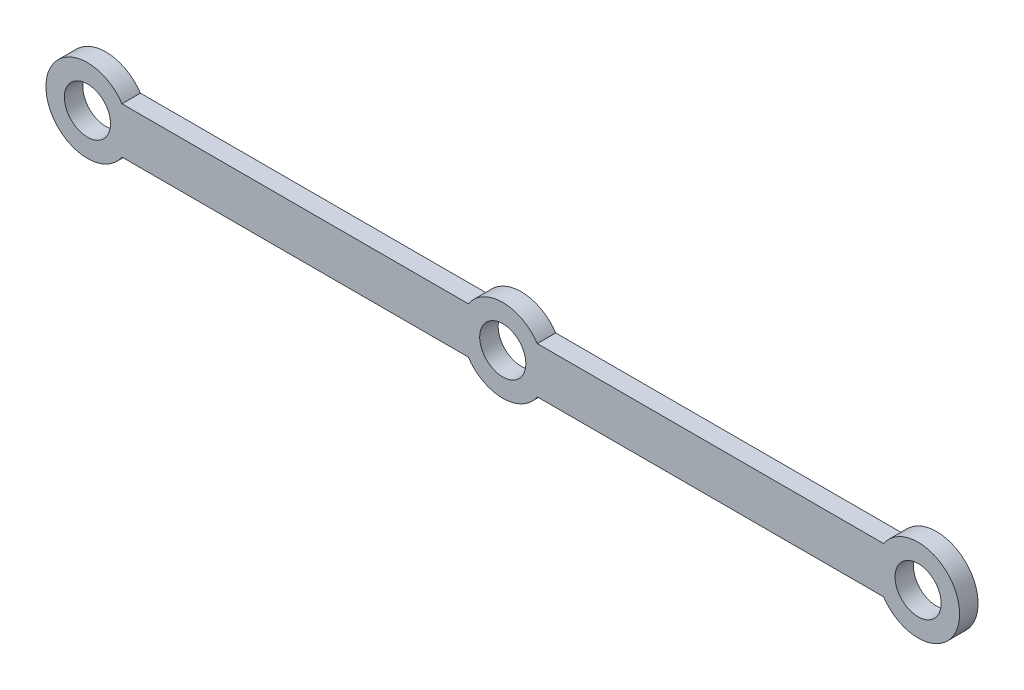
ISO-10303-21;
HEADER;
FILE_DESCRIPTION(('STEP AP214'),'2;1');
FILE_NAME('part.step','',(''),(''),'','','');
FILE_SCHEMA(('AUTOMOTIVE_DESIGN { 1 0 10303 214 1 1 1 1 }'));
ENDSEC;
DATA;
#1=APPLICATION_CONTEXT('core data for automotive mechanical design processes');
#2=APPLICATION_PROTOCOL_DEFINITION('international standard','automotive_design',2000,#1);
#3=PRODUCT_CONTEXT('',#1,'mechanical');
#4=PRODUCT('Part','Part','',(#3));
#5=PRODUCT_RELATED_PRODUCT_CATEGORY('part','',(#4));
#6=PRODUCT_DEFINITION_FORMATION('','',#4);
#7=PRODUCT_DEFINITION_CONTEXT('part definition',#1,'design');
#8=PRODUCT_DEFINITION('design','',#6,#7);
#9=PRODUCT_DEFINITION_SHAPE('','',#8);
#10=(LENGTH_UNIT() NAMED_UNIT(*) SI_UNIT(.MILLI.,.METRE.));
#11=(NAMED_UNIT(*) PLANE_ANGLE_UNIT() SI_UNIT($,.RADIAN.));
#12=(NAMED_UNIT(*) SI_UNIT($,.STERADIAN.) SOLID_ANGLE_UNIT());
#13=UNCERTAINTY_MEASURE_WITH_UNIT(LENGTH_MEASURE(1.E-05),#10,'distance_accuracy_value','');
#14=(GEOMETRIC_REPRESENTATION_CONTEXT(3) GLOBAL_UNCERTAINTY_ASSIGNED_CONTEXT((#13)) GLOBAL_UNIT_ASSIGNED_CONTEXT((#10,
#11,#12)) REPRESENTATION_CONTEXT('',''));
#15=CARTESIAN_POINT('',(0.,0.,0.));
#16=DIRECTION('',(0.,0.,1.));
#17=DIRECTION('',(1.,0.,0.));
#18=AXIS2_PLACEMENT_3D('',#15,#16,#17);
#19=CARTESIAN_POINT('',(0.,0.,1.));
#20=DIRECTION('',(0.,0.,1.));
#21=DIRECTION('',(1.,0.,0.));
#22=AXIS2_PLACEMENT_3D('',#19,#20,#21);
#23=PLANE('',#22);
#24=CARTESIAN_POINT('',(0.,0.,1.));
#25=DIRECTION('',(0.,0.,1.));
#26=DIRECTION('',(1.,0.,0.));
#27=AXIS2_PLACEMENT_3D('',#24,#25,#26);
#28=CIRCLE('',#27,2.5);
#29=CARTESIAN_POINT('',(2.5,0.,1.));
#30=VERTEX_POINT('',#29);
#31=EDGE_CURVE('E296',#30,#30,#28,.T.);
#32=ORIENTED_EDGE('',*,*,#31,.F.);
#33=EDGE_LOOP('',(#32));
#34=FACE_BOUND('',#33,.T.);
#35=CARTESIAN_POINT('',(0.,0.,1.));
#36=DIRECTION('',(0.,0.,1.));
#37=DIRECTION('',(1.,0.,0.));
#38=AXIS2_PLACEMENT_3D('',#35,#36,#37);
#39=CIRCLE('',#38,4.5);
#40=CARTESIAN_POINT('',(-3.74165738677395,-2.49999999999998,1.));
#41=VERTEX_POINT('',#40);
#42=CARTESIAN_POINT('',(3.74165738677395,-2.49999999999998,1.));
#43=VERTEX_POINT('',#42);
#44=EDGE_CURVE('E255',#41,#43,#39,.T.);
#45=ORIENTED_EDGE('',*,*,#44,.T.);
#46=DIRECTION('',(1.,0.,0.));
#47=VECTOR('',#46,1.);
#48=CARTESIAN_POINT('',(3.74165738677395,-2.49999999999998,1.));
#49=LINE('',#48,#47);
#50=CARTESIAN_POINT('',(41.2583426132261,-2.49999999999998,1.));
#51=VERTEX_POINT('',#50);
#52=EDGE_CURVE('E184',#43,#51,#49,.T.);
#53=ORIENTED_EDGE('',*,*,#52,.T.);
#54=CARTESIAN_POINT('',(45.,0.,1.));
#55=DIRECTION('',(0.,0.,1.));
#56=DIRECTION('',(1.,0.,0.));
#57=AXIS2_PLACEMENT_3D('',#54,#55,#56);
#58=CIRCLE('',#57,4.5);
#59=CARTESIAN_POINT('',(41.258342613226,2.50000000000001,1.));
#60=VERTEX_POINT('',#59);
#61=EDGE_CURVE('E274',#51,#60,#58,.T.);
#62=ORIENTED_EDGE('',*,*,#61,.T.);
#63=DIRECTION('',(1.,0.,0.));
#64=VECTOR('',#63,1.);
#65=CARTESIAN_POINT('',(3.74165738677394,2.5,1.));
#66=LINE('',#65,#64);
#67=CARTESIAN_POINT('',(3.74165738677394,2.5,1.));
#68=VERTEX_POINT('',#67);
#69=EDGE_CURVE('E222',#68,#60,#66,.T.);
#70=ORIENTED_EDGE('',*,*,#69,.F.);
#71=CARTESIAN_POINT('',(0.,0.,1.));
#72=DIRECTION('',(0.,0.,1.));
#73=DIRECTION('',(1.,0.,0.));
#74=AXIS2_PLACEMENT_3D('',#71,#72,#73);
#75=CIRCLE('',#74,4.5);
#76=CARTESIAN_POINT('',(-3.74165738677394,2.5,1.));
#77=VERTEX_POINT('',#76);
#78=EDGE_CURVE('E217',#68,#77,#75,.T.);
#79=ORIENTED_EDGE('',*,*,#78,.T.);
#80=DIRECTION('',(1.,0.,0.));
#81=VECTOR('',#80,1.);
#82=CARTESIAN_POINT('',(-41.2583426132261,2.5,1.));
#83=LINE('',#82,#81);
#84=CARTESIAN_POINT('',(-41.2583426132261,2.5,1.));
#85=VERTEX_POINT('',#84);
#86=EDGE_CURVE('E203',#85,#77,#83,.T.);
#87=ORIENTED_EDGE('',*,*,#86,.F.);
#88=CARTESIAN_POINT('',(-45.,0.,1.));
#89=DIRECTION('',(0.,0.,1.));
#90=DIRECTION('',(1.,0.,0.));
#91=AXIS2_PLACEMENT_3D('',#88,#89,#90);
#92=CIRCLE('',#91,4.5);
#93=CARTESIAN_POINT('',(-41.258342613226,-2.49999999999999,1.));
#94=VERTEX_POINT('',#93);
#95=EDGE_CURVE('E210',#85,#94,#92,.T.);
#96=ORIENTED_EDGE('',*,*,#95,.T.);
#97=DIRECTION('',(1.,0.,0.));
#98=VECTOR('',#97,1.);
#99=CARTESIAN_POINT('',(-41.258342613226,-2.49999999999998,1.));
#100=LINE('',#99,#98);
#101=EDGE_CURVE('E142',#94,#41,#100,.T.);
#102=ORIENTED_EDGE('',*,*,#101,.T.);
#103=EDGE_LOOP('',(#45,#53,#62,#70,#79,#87,#96,#102));
#104=FACE_BOUND('',#103,.T.);
#105=CARTESIAN_POINT('',(-45.,0.,1.));
#106=DIRECTION('',(0.,0.,1.));
#107=DIRECTION('',(1.,0.,0.));
#108=AXIS2_PLACEMENT_3D('',#105,#106,#107);
#109=CIRCLE('',#108,2.5);
#110=CARTESIAN_POINT('',(-42.5,0.,1.));
#111=VERTEX_POINT('',#110);
#112=EDGE_CURVE('E234',#111,#111,#109,.T.);
#113=ORIENTED_EDGE('',*,*,#112,.F.);
#114=EDGE_LOOP('',(#113));
#115=FACE_BOUND('',#114,.T.);
#116=CARTESIAN_POINT('',(45.,0.,1.));
#117=DIRECTION('',(0.,0.,1.));
#118=DIRECTION('',(1.,0.,0.));
#119=AXIS2_PLACEMENT_3D('',#116,#117,#118);
#120=CIRCLE('',#119,2.5);
#121=CARTESIAN_POINT('',(47.5,0.,1.));
#122=VERTEX_POINT('',#121);
#123=EDGE_CURVE('E304',#122,#122,#120,.T.);
#124=ORIENTED_EDGE('',*,*,#123,.F.);
#125=EDGE_LOOP('',(#124));
#126=FACE_BOUND('',#125,.T.);
#127=ADVANCED_FACE('F124',(#34,#104,#115,#126),#23,.T.);
#128=CARTESIAN_POINT('',(0.,0.,-1.));
#129=DIRECTION('',(0.,0.,1.));
#130=DIRECTION('',(1.,0.,0.));
#131=AXIS2_PLACEMENT_3D('',#128,#129,#130);
#132=PLANE('',#131);
#133=CARTESIAN_POINT('',(0.,0.,-1.));
#134=DIRECTION('',(0.,0.,1.));
#135=DIRECTION('',(1.,0.,0.));
#136=AXIS2_PLACEMENT_3D('',#133,#134,#135);
#137=CIRCLE('',#136,4.5);
#138=CARTESIAN_POINT('',(-3.74165738677395,-2.49999999999998,-1.));
#139=VERTEX_POINT('',#138);
#140=CARTESIAN_POINT('',(3.74165738677395,-2.49999999999998,-1.));
#141=VERTEX_POINT('',#140);
#142=EDGE_CURVE('E229',#139,#141,#137,.T.);
#143=ORIENTED_EDGE('',*,*,#142,.F.);
#144=DIRECTION('',(1.,0.,0.));
#145=VECTOR('',#144,1.);
#146=CARTESIAN_POINT('',(-41.258342613226,-2.49999999999998,-1.));
#147=LINE('',#146,#145);
#148=CARTESIAN_POINT('',(-41.258342613226,-2.49999999999999,-1.));
#149=VERTEX_POINT('',#148);
#150=EDGE_CURVE('E176',#149,#139,#147,.T.);
#151=ORIENTED_EDGE('',*,*,#150,.F.);
#152=CARTESIAN_POINT('',(-45.,0.,-1.));
#153=DIRECTION('',(0.,0.,1.));
#154=DIRECTION('',(1.,0.,0.));
#155=AXIS2_PLACEMENT_3D('',#152,#153,#154);
#156=CIRCLE('',#155,4.5);
#157=CARTESIAN_POINT('',(-41.2583426132261,2.5,-1.));
#158=VERTEX_POINT('',#157);
#159=EDGE_CURVE('E170',#158,#149,#156,.T.);
#160=ORIENTED_EDGE('',*,*,#159,.F.);
#161=DIRECTION('',(1.,0.,0.));
#162=VECTOR('',#161,1.);
#163=CARTESIAN_POINT('',(-41.2583426132261,2.5,-1.));
#164=LINE('',#163,#162);
#165=CARTESIAN_POINT('',(-3.74165738677394,2.5,-1.));
#166=VERTEX_POINT('',#165);
#167=EDGE_CURVE('E205',#158,#166,#164,.T.);
#168=ORIENTED_EDGE('',*,*,#167,.T.);
#169=CARTESIAN_POINT('',(0.,0.,-1.));
#170=DIRECTION('',(0.,0.,1.));
#171=DIRECTION('',(1.,0.,0.));
#172=AXIS2_PLACEMENT_3D('',#169,#170,#171);
#173=CIRCLE('',#172,4.5);
#174=CARTESIAN_POINT('',(3.74165738677394,2.5,-1.));
#175=VERTEX_POINT('',#174);
#176=EDGE_CURVE('E245',#175,#166,#173,.T.);
#177=ORIENTED_EDGE('',*,*,#176,.F.);
#178=DIRECTION('',(1.,0.,0.));
#179=VECTOR('',#178,1.);
#180=CARTESIAN_POINT('',(3.74165738677394,2.5,-1.));
#181=LINE('',#180,#179);
#182=CARTESIAN_POINT('',(41.258342613226,2.50000000000001,-1.));
#183=VERTEX_POINT('',#182);
#184=EDGE_CURVE('E241',#175,#183,#181,.T.);
#185=ORIENTED_EDGE('',*,*,#184,.T.);
#186=CARTESIAN_POINT('',(45.,0.,-1.));
#187=DIRECTION('',(0.,0.,1.));
#188=DIRECTION('',(1.,0.,0.));
#189=AXIS2_PLACEMENT_3D('',#186,#187,#188);
#190=CIRCLE('',#189,4.5);
#191=CARTESIAN_POINT('',(41.2583426132261,-2.49999999999998,-1.));
#192=VERTEX_POINT('',#191);
#193=EDGE_CURVE('E237',#192,#183,#190,.T.);
#194=ORIENTED_EDGE('',*,*,#193,.F.);
#195=DIRECTION('',(1.,0.,0.));
#196=VECTOR('',#195,1.);
#197=CARTESIAN_POINT('',(3.74165738677395,-2.49999999999998,-1.));
#198=LINE('',#197,#196);
#199=EDGE_CURVE('E233',#141,#192,#198,.T.);
#200=ORIENTED_EDGE('',*,*,#199,.F.);
#201=EDGE_LOOP('',(#143,#151,#160,#168,#177,#185,#194,#200));
#202=FACE_BOUND('',#201,.T.);
#203=CARTESIAN_POINT('',(-45.,0.,-1.));
#204=DIRECTION('',(0.,0.,1.));
#205=DIRECTION('',(1.,0.,0.));
#206=AXIS2_PLACEMENT_3D('',#203,#204,#205);
#207=CIRCLE('',#206,2.5);
#208=CARTESIAN_POINT('',(-42.5,0.,-1.));
#209=VERTEX_POINT('',#208);
#210=EDGE_CURVE('E292',#209,#209,#207,.T.);
#211=ORIENTED_EDGE('',*,*,#210,.T.);
#212=EDGE_LOOP('',(#211));
#213=FACE_BOUND('',#212,.T.);
#214=CARTESIAN_POINT('',(0.,0.,-1.));
#215=DIRECTION('',(0.,0.,1.));
#216=DIRECTION('',(1.,0.,0.));
#217=AXIS2_PLACEMENT_3D('',#214,#215,#216);
#218=CIRCLE('',#217,2.5);
#219=CARTESIAN_POINT('',(2.5,0.,-1.));
#220=VERTEX_POINT('',#219);
#221=EDGE_CURVE('E300',#220,#220,#218,.T.);
#222=ORIENTED_EDGE('',*,*,#221,.T.);
#223=EDGE_LOOP('',(#222));
#224=FACE_BOUND('',#223,.T.);
#225=CARTESIAN_POINT('',(45.,0.,-1.));
#226=DIRECTION('',(0.,0.,1.));
#227=DIRECTION('',(1.,0.,0.));
#228=AXIS2_PLACEMENT_3D('',#225,#226,#227);
#229=CIRCLE('',#228,2.5);
#230=CARTESIAN_POINT('',(47.5,0.,-1.));
#231=VERTEX_POINT('',#230);
#232=EDGE_CURVE('E308',#231,#231,#229,.T.);
#233=ORIENTED_EDGE('',*,*,#232,.T.);
#234=EDGE_LOOP('',(#233));
#235=FACE_BOUND('',#234,.T.);
#236=ADVANCED_FACE('F277',(#202,#213,#224,#235),#132,.F.);
#237=CARTESIAN_POINT('',(0.,0.,1.));
#238=DIRECTION('',(0.,0.,-1.));
#239=DIRECTION('',(-1.,0.,0.));
#240=AXIS2_PLACEMENT_3D('',#237,#238,#239);
#241=CYLINDRICAL_SURFACE('',#240,4.5);
#242=ORIENTED_EDGE('',*,*,#142,.T.);
#243=DIRECTION('',(0.,0.,-1.));
#244=VECTOR('',#243,1.);
#245=CARTESIAN_POINT('',(3.74165738677395,-2.49999999999998,1.));
#246=LINE('',#245,#244);
#247=EDGE_CURVE('E12',#43,#141,#246,.T.);
#248=ORIENTED_EDGE('',*,*,#247,.F.);
#249=ORIENTED_EDGE('',*,*,#44,.F.);
#250=DIRECTION('',(0.,0.,-1.));
#251=VECTOR('',#250,1.);
#252=CARTESIAN_POINT('',(-3.74165738677395,-2.49999999999998,1.));
#253=LINE('',#252,#251);
#254=EDGE_CURVE('E228',#41,#139,#253,.T.);
#255=ORIENTED_EDGE('',*,*,#254,.T.);
#256=EDGE_LOOP('',(#242,#248,#249,#255));
#257=FACE_BOUND('',#256,.T.);
#258=ADVANCED_FACE('F126',(#257),#241,.T.);
#259=CARTESIAN_POINT('',(3.74165738677395,-2.49999999999998,1.));
#260=DIRECTION('',(0.,1.,0.));
#261=DIRECTION('',(0.,0.,1.));
#262=AXIS2_PLACEMENT_3D('',#259,#260,#261);
#263=PLANE('',#262);
#264=ORIENTED_EDGE('',*,*,#199,.T.);
#265=DIRECTION('',(0.,0.,-1.));
#266=VECTOR('',#265,1.);
#267=CARTESIAN_POINT('',(41.2583426132261,-2.49999999999998,1.));
#268=LINE('',#267,#266);
#269=EDGE_CURVE('E134',#51,#192,#268,.T.);
#270=ORIENTED_EDGE('',*,*,#269,.F.);
#271=ORIENTED_EDGE('',*,*,#52,.F.);
#272=ORIENTED_EDGE('',*,*,#247,.T.);
#273=EDGE_LOOP('',(#264,#270,#271,#272));
#274=FACE_BOUND('',#273,.T.);
#275=ADVANCED_FACE('F345',(#274),#263,.F.);
#276=CARTESIAN_POINT('',(45.,0.,1.));
#277=DIRECTION('',(0.,0.,-1.));
#278=DIRECTION('',(-1.,0.,0.));
#279=AXIS2_PLACEMENT_3D('',#276,#277,#278);
#280=CYLINDRICAL_SURFACE('',#279,4.5);
#281=ORIENTED_EDGE('',*,*,#193,.T.);
#282=DIRECTION('',(0.,0.,-1.));
#283=VECTOR('',#282,1.);
#284=CARTESIAN_POINT('',(41.258342613226,2.50000000000001,1.));
#285=LINE('',#284,#283);
#286=EDGE_CURVE('E265',#60,#183,#285,.T.);
#287=ORIENTED_EDGE('',*,*,#286,.F.);
#288=ORIENTED_EDGE('',*,*,#61,.F.);
#289=ORIENTED_EDGE('',*,*,#269,.T.);
#290=EDGE_LOOP('',(#281,#287,#288,#289));
#291=FACE_BOUND('',#290,.T.);
#292=ADVANCED_FACE('F272',(#291),#280,.T.);
#293=CARTESIAN_POINT('',(3.74165738677394,2.5,1.));
#294=DIRECTION('',(0.,1.,0.));
#295=DIRECTION('',(0.,0.,1.));
#296=AXIS2_PLACEMENT_3D('',#293,#294,#295);
#297=PLANE('',#296);
#298=ORIENTED_EDGE('',*,*,#184,.F.);
#299=DIRECTION('',(0.,0.,-1.));
#300=VECTOR('',#299,1.);
#301=CARTESIAN_POINT('',(3.74165738677394,2.5,1.));
#302=LINE('',#301,#300);
#303=EDGE_CURVE('E262',#68,#175,#302,.T.);
#304=ORIENTED_EDGE('',*,*,#303,.F.);
#305=ORIENTED_EDGE('',*,*,#69,.T.);
#306=ORIENTED_EDGE('',*,*,#286,.T.);
#307=EDGE_LOOP('',(#298,#304,#305,#306));
#308=FACE_BOUND('',#307,.T.);
#309=ADVANCED_FACE('F282',(#308),#297,.T.);
#310=CARTESIAN_POINT('',(0.,0.,1.));
#311=DIRECTION('',(0.,0.,-1.));
#312=DIRECTION('',(-1.,0.,0.));
#313=AXIS2_PLACEMENT_3D('',#310,#311,#312);
#314=CYLINDRICAL_SURFACE('',#313,4.5);
#315=ORIENTED_EDGE('',*,*,#176,.T.);
#316=DIRECTION('',(0.,0.,-1.));
#317=VECTOR('',#316,1.);
#318=CARTESIAN_POINT('',(-3.74165738677394,2.5,1.));
#319=LINE('',#318,#317);
#320=EDGE_CURVE('E207',#77,#166,#319,.T.);
#321=ORIENTED_EDGE('',*,*,#320,.F.);
#322=ORIENTED_EDGE('',*,*,#78,.F.);
#323=ORIENTED_EDGE('',*,*,#303,.T.);
#324=EDGE_LOOP('',(#315,#321,#322,#323));
#325=FACE_BOUND('',#324,.T.);
#326=ADVANCED_FACE('F338',(#325),#314,.T.);
#327=CARTESIAN_POINT('',(-41.2583426132261,2.5,1.));
#328=DIRECTION('',(0.,1.,0.));
#329=DIRECTION('',(0.,0.,1.));
#330=AXIS2_PLACEMENT_3D('',#327,#328,#329);
#331=PLANE('',#330);
#332=ORIENTED_EDGE('',*,*,#167,.F.);
#333=DIRECTION('',(0.,0.,-1.));
#334=VECTOR('',#333,1.);
#335=CARTESIAN_POINT('',(-41.2583426132261,2.5,1.));
#336=LINE('',#335,#334);
#337=EDGE_CURVE('E199',#85,#158,#336,.T.);
#338=ORIENTED_EDGE('',*,*,#337,.F.);
#339=ORIENTED_EDGE('',*,*,#86,.T.);
#340=ORIENTED_EDGE('',*,*,#320,.T.);
#341=EDGE_LOOP('',(#332,#338,#339,#340));
#342=FACE_BOUND('',#341,.T.);
#343=ADVANCED_FACE('F201',(#342),#331,.T.);
#344=CARTESIAN_POINT('',(-45.,0.,1.));
#345=DIRECTION('',(0.,0.,-1.));
#346=DIRECTION('',(-1.,0.,0.));
#347=AXIS2_PLACEMENT_3D('',#344,#345,#346);
#348=CYLINDRICAL_SURFACE('',#347,4.5);
#349=ORIENTED_EDGE('',*,*,#159,.T.);
#350=DIRECTION('',(0.,0.,-1.));
#351=VECTOR('',#350,1.);
#352=CARTESIAN_POINT('',(-41.258342613226,-2.49999999999999,1.));
#353=LINE('',#352,#351);
#354=EDGE_CURVE('E208',#94,#149,#353,.T.);
#355=ORIENTED_EDGE('',*,*,#354,.F.);
#356=ORIENTED_EDGE('',*,*,#95,.F.);
#357=ORIENTED_EDGE('',*,*,#337,.T.);
#358=EDGE_LOOP('',(#349,#355,#356,#357));
#359=FACE_BOUND('',#358,.T.);
#360=ADVANCED_FACE('F211',(#359),#348,.T.);
#361=CARTESIAN_POINT('',(-41.258342613226,-2.49999999999998,1.));
#362=DIRECTION('',(0.,1.,0.));
#363=DIRECTION('',(0.,0.,1.));
#364=AXIS2_PLACEMENT_3D('',#361,#362,#363);
#365=PLANE('',#364);
#366=ORIENTED_EDGE('',*,*,#150,.T.);
#367=ORIENTED_EDGE('',*,*,#254,.F.);
#368=ORIENTED_EDGE('',*,*,#101,.F.);
#369=ORIENTED_EDGE('',*,*,#354,.T.);
#370=EDGE_LOOP('',(#366,#367,#368,#369));
#371=FACE_BOUND('',#370,.T.);
#372=ADVANCED_FACE('F331',(#371),#365,.F.);
#373=CARTESIAN_POINT('',(-45.,0.,1.));
#374=DIRECTION('',(0.,0.,-1.));
#375=DIRECTION('',(-1.,0.,0.));
#376=AXIS2_PLACEMENT_3D('',#373,#374,#375);
#377=CYLINDRICAL_SURFACE('',#376,2.5);
#378=ORIENTED_EDGE('',*,*,#112,.T.);
#379=EDGE_LOOP('',(#378));
#380=FACE_BOUND('',#379,.T.);
#381=ORIENTED_EDGE('',*,*,#210,.F.);
#382=EDGE_LOOP('',(#381));
#383=FACE_BOUND('',#382,.T.);
#384=ADVANCED_FACE('F328',(#380,#383),#377,.F.);
#385=CARTESIAN_POINT('',(0.,0.,1.));
#386=DIRECTION('',(0.,0.,-1.));
#387=DIRECTION('',(-1.,0.,0.));
#388=AXIS2_PLACEMENT_3D('',#385,#386,#387);
#389=CYLINDRICAL_SURFACE('',#388,2.5);
#390=ORIENTED_EDGE('',*,*,#31,.T.);
#391=EDGE_LOOP('',(#390));
#392=FACE_BOUND('',#391,.T.);
#393=ORIENTED_EDGE('',*,*,#221,.F.);
#394=EDGE_LOOP('',(#393));
#395=FACE_BOUND('',#394,.T.);
#396=ADVANCED_FACE('F421',(#392,#395),#389,.F.);
#397=CARTESIAN_POINT('',(45.,0.,1.));
#398=DIRECTION('',(0.,0.,-1.));
#399=DIRECTION('',(-1.,0.,0.));
#400=AXIS2_PLACEMENT_3D('',#397,#398,#399);
#401=CYLINDRICAL_SURFACE('',#400,2.5);
#402=ORIENTED_EDGE('',*,*,#123,.T.);
#403=EDGE_LOOP('',(#402));
#404=FACE_BOUND('',#403,.T.);
#405=ORIENTED_EDGE('',*,*,#232,.F.);
#406=EDGE_LOOP('',(#405));
#407=FACE_BOUND('',#406,.T.);
#408=ADVANCED_FACE('F316',(#404,#407),#401,.F.);
#409=CLOSED_SHELL('',(#127,#236,#258,#275,#292,#309,#326,#343,#360,#372,#384,#396,#408));
#410=MANIFOLD_SOLID_BREP('B2',#409);
#411=ADVANCED_BREP_SHAPE_REPRESENTATION('',(#18,#410),#14);
#412=SHAPE_DEFINITION_REPRESENTATION(#9,#411);
ENDSEC;
END-ISO-10303-21;
